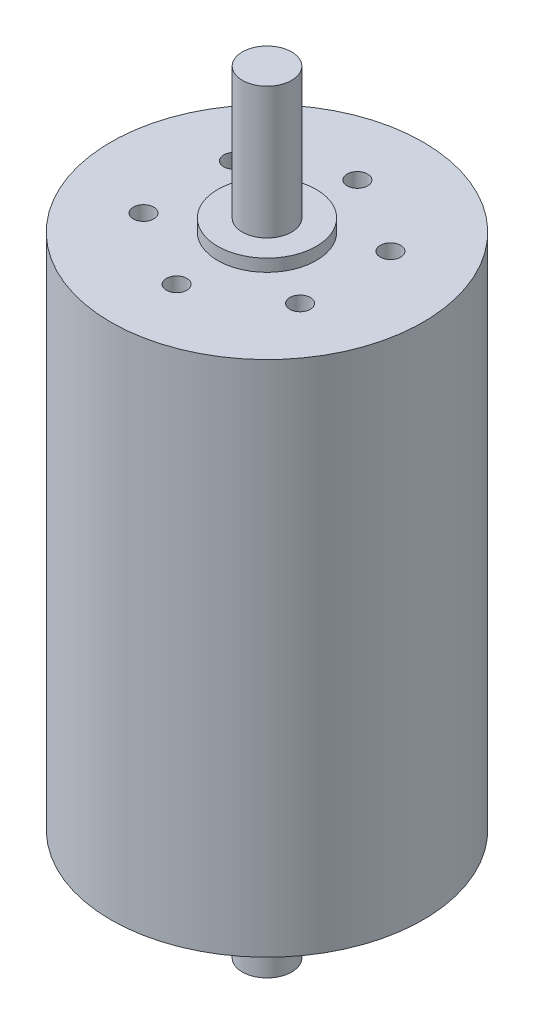
ISO-10303-21;
HEADER;
FILE_DESCRIPTION(('STEP AP214'),'2;1');
FILE_NAME('part.step','',(''),(''),'','','');
FILE_SCHEMA(('AUTOMOTIVE_DESIGN { 1 0 10303 214 1 1 1 1 }'));
ENDSEC;
DATA;
#1=APPLICATION_CONTEXT('core data for automotive mechanical design processes');
#2=APPLICATION_PROTOCOL_DEFINITION('international standard','automotive_design',2000,#1);
#3=PRODUCT_CONTEXT('',#1,'mechanical');
#4=PRODUCT('Part','Part','',(#3));
#5=PRODUCT_RELATED_PRODUCT_CATEGORY('part','',(#4));
#6=PRODUCT_DEFINITION_FORMATION('','',#4);
#7=PRODUCT_DEFINITION_CONTEXT('part definition',#1,'design');
#8=PRODUCT_DEFINITION('design','',#6,#7);
#9=PRODUCT_DEFINITION_SHAPE('','',#8);
#10=(LENGTH_UNIT() NAMED_UNIT(*) SI_UNIT(.MILLI.,.METRE.));
#11=(NAMED_UNIT(*) PLANE_ANGLE_UNIT() SI_UNIT($,.RADIAN.));
#12=(NAMED_UNIT(*) SI_UNIT($,.STERADIAN.) SOLID_ANGLE_UNIT());
#13=UNCERTAINTY_MEASURE_WITH_UNIT(LENGTH_MEASURE(1.E-05),#10,'distance_accuracy_value','');
#14=(GEOMETRIC_REPRESENTATION_CONTEXT(3) GLOBAL_UNCERTAINTY_ASSIGNED_CONTEXT((#13)) GLOBAL_UNIT_ASSIGNED_CONTEXT((#10,
#11,#12)) REPRESENTATION_CONTEXT('',''));
#15=CARTESIAN_POINT('',(0.,0.,0.));
#16=DIRECTION('',(0.,0.,1.));
#17=DIRECTION('',(1.,0.,0.));
#18=AXIS2_PLACEMENT_3D('',#15,#16,#17);
#19=CARTESIAN_POINT('',(3.,0.,0.));
#20=DIRECTION('',(0.,-1.,0.));
#21=DIRECTION('',(0.,0.,-1.));
#22=AXIS2_PLACEMENT_3D('',#19,#20,#21);
#23=PLANE('',#22);
#24=CARTESIAN_POINT('',(0.,0.,0.));
#25=DIRECTION('',(0.,-1.,0.));
#26=DIRECTION('',(0.,0.,-1.));
#27=AXIS2_PLACEMENT_3D('',#24,#25,#26);
#28=CIRCLE('',#27,3.);
#29=CARTESIAN_POINT('',(0.,0.,-3.));
#30=VERTEX_POINT('',#29);
#31=EDGE_CURVE('E67',#30,#30,#28,.T.);
#32=ORIENTED_EDGE('',*,*,#31,.T.);
#33=EDGE_LOOP('',(#32));
#34=FACE_BOUND('',#33,.T.);
#35=ADVANCED_FACE('F33',(#34),#23,.T.);
#36=CARTESIAN_POINT('',(0.,94.,0.));
#37=DIRECTION('',(0.,1.,0.));
#38=DIRECTION('',(0.,0.,1.));
#39=AXIS2_PLACEMENT_3D('',#36,#37,#38);
#40=PLANE('',#39);
#41=CARTESIAN_POINT('',(0.,94.,0.));
#42=DIRECTION('',(0.,-1.,0.));
#43=DIRECTION('',(0.,0.,-1.));
#44=AXIS2_PLACEMENT_3D('',#41,#42,#43);
#45=CIRCLE('',#44,2.99999999999999);
#46=CARTESIAN_POINT('',(0.,94.,-2.99999999999999));
#47=VERTEX_POINT('',#46);
#48=EDGE_CURVE('E10',#47,#47,#45,.T.);
#49=ORIENTED_EDGE('',*,*,#48,.F.);
#50=EDGE_LOOP('',(#49));
#51=FACE_BOUND('',#50,.T.);
#52=ADVANCED_FACE('F191',(#51),#40,.T.);
#53=CARTESIAN_POINT('',(0.,0.,0.));
#54=DIRECTION('',(0.,-1.,0.));
#55=DIRECTION('',(0.,0.,-1.));
#56=AXIS2_PLACEMENT_3D('',#53,#54,#55);
#57=CYLINDRICAL_SURFACE('',#56,2.99999999999999);
#58=ORIENTED_EDGE('',*,*,#48,.T.);
#59=EDGE_LOOP('',(#58));
#60=FACE_BOUND('',#59,.T.);
#61=CARTESIAN_POINT('',(0.,78.,0.));
#62=DIRECTION('',(0.,-1.,0.));
#63=DIRECTION('',(0.,0.,-1.));
#64=AXIS2_PLACEMENT_3D('',#61,#62,#63);
#65=CIRCLE('',#64,2.99999999999999);
#66=CARTESIAN_POINT('',(0.,78.,-2.99999999999999));
#67=VERTEX_POINT('',#66);
#68=EDGE_CURVE('E39',#67,#67,#65,.T.);
#69=ORIENTED_EDGE('',*,*,#68,.F.);
#70=EDGE_LOOP('',(#69));
#71=FACE_BOUND('',#70,.T.);
#72=ADVANCED_FACE('F195',(#60,#71),#57,.T.);
#73=CARTESIAN_POINT('',(2.99999999999999,78.,0.));
#74=DIRECTION('',(0.,1.,0.));
#75=DIRECTION('',(0.,0.,1.));
#76=AXIS2_PLACEMENT_3D('',#73,#74,#75);
#77=PLANE('',#76);
#78=ORIENTED_EDGE('',*,*,#68,.T.);
#79=EDGE_LOOP('',(#78));
#80=FACE_BOUND('',#79,.T.);
#81=CARTESIAN_POINT('',(0.,78.,0.));
#82=DIRECTION('',(0.,-1.,0.));
#83=DIRECTION('',(0.,0.,-1.));
#84=AXIS2_PLACEMENT_3D('',#81,#82,#83);
#85=CIRCLE('',#84,5.99999999999999);
#86=CARTESIAN_POINT('',(0.,78.,-5.99999999999999));
#87=VERTEX_POINT('',#86);
#88=EDGE_CURVE('E43',#87,#87,#85,.T.);
#89=ORIENTED_EDGE('',*,*,#88,.F.);
#90=EDGE_LOOP('',(#89));
#91=FACE_BOUND('',#90,.T.);
#92=ADVANCED_FACE('F200',(#80,#91),#77,.T.);
#93=CARTESIAN_POINT('',(0.,0.,0.));
#94=DIRECTION('',(0.,-1.,0.));
#95=DIRECTION('',(0.,0.,-1.));
#96=AXIS2_PLACEMENT_3D('',#93,#94,#95);
#97=CYLINDRICAL_SURFACE('',#96,5.99999999999999);
#98=ORIENTED_EDGE('',*,*,#88,.T.);
#99=EDGE_LOOP('',(#98));
#100=FACE_BOUND('',#99,.T.);
#101=CARTESIAN_POINT('',(0.,76.5,0.));
#102=DIRECTION('',(0.,-1.,0.));
#103=DIRECTION('',(0.,0.,-1.));
#104=AXIS2_PLACEMENT_3D('',#101,#102,#103);
#105=CIRCLE('',#104,5.99999999999999);
#106=CARTESIAN_POINT('',(0.,76.5,-5.99999999999999));
#107=VERTEX_POINT('',#106);
#108=EDGE_CURVE('E47',#107,#107,#105,.T.);
#109=ORIENTED_EDGE('',*,*,#108,.F.);
#110=EDGE_LOOP('',(#109));
#111=FACE_BOUND('',#110,.T.);
#112=ADVANCED_FACE('F205',(#100,#111),#97,.T.);
#113=CARTESIAN_POINT('',(5.99999999999999,76.5,0.));
#114=DIRECTION('',(0.,1.,0.));
#115=DIRECTION('',(0.,0.,1.));
#116=AXIS2_PLACEMENT_3D('',#113,#114,#115);
#117=PLANE('',#116);
#118=CARTESIAN_POINT('',(9.52627944162882,76.5,-5.5));
#119=DIRECTION('',(0.,1.,0.));
#120=DIRECTION('',(0.,0.,1.));
#121=AXIS2_PLACEMENT_3D('',#118,#119,#120);
#122=CIRCLE('',#121,1.25);
#123=CARTESIAN_POINT('',(9.52627944162882,76.5,-4.25));
#124=VERTEX_POINT('',#123);
#125=EDGE_CURVE('E102',#124,#124,#122,.T.);
#126=ORIENTED_EDGE('',*,*,#125,.F.);
#127=EDGE_LOOP('',(#126));
#128=FACE_BOUND('',#127,.T.);
#129=CARTESIAN_POINT('',(9.52627944162883,76.5,5.5));
#130=DIRECTION('',(0.,1.,0.));
#131=DIRECTION('',(0.,0.,1.));
#132=AXIS2_PLACEMENT_3D('',#129,#130,#131);
#133=CIRCLE('',#132,1.25);
#134=CARTESIAN_POINT('',(9.52627944162883,76.5,6.75));
#135=VERTEX_POINT('',#134);
#136=EDGE_CURVE('E96',#135,#135,#133,.T.);
#137=ORIENTED_EDGE('',*,*,#136,.F.);
#138=EDGE_LOOP('',(#137));
#139=FACE_BOUND('',#138,.T.);
#140=CARTESIAN_POINT('',(0.,76.5,11.));
#141=DIRECTION('',(0.,1.,0.));
#142=DIRECTION('',(0.,0.,1.));
#143=AXIS2_PLACEMENT_3D('',#140,#141,#142);
#144=CIRCLE('',#143,1.25);
#145=CARTESIAN_POINT('',(0.,76.5,12.25));
#146=VERTEX_POINT('',#145);
#147=EDGE_CURVE('E90',#146,#146,#144,.T.);
#148=ORIENTED_EDGE('',*,*,#147,.F.);
#149=EDGE_LOOP('',(#148));
#150=FACE_BOUND('',#149,.T.);
#151=CARTESIAN_POINT('',(-9.52627944162882,76.5,5.50000000000001));
#152=DIRECTION('',(0.,1.,0.));
#153=DIRECTION('',(0.,0.,1.));
#154=AXIS2_PLACEMENT_3D('',#151,#152,#153);
#155=CIRCLE('',#154,1.25);
#156=CARTESIAN_POINT('',(-9.52627944162882,76.5,6.75));
#157=VERTEX_POINT('',#156);
#158=EDGE_CURVE('E84',#157,#157,#155,.T.);
#159=ORIENTED_EDGE('',*,*,#158,.F.);
#160=EDGE_LOOP('',(#159));
#161=FACE_BOUND('',#160,.T.);
#162=CARTESIAN_POINT('',(-9.52627944162883,76.5,-5.49999999999999));
#163=DIRECTION('',(0.,1.,0.));
#164=DIRECTION('',(0.,0.,1.));
#165=AXIS2_PLACEMENT_3D('',#162,#163,#164);
#166=CIRCLE('',#165,1.25);
#167=CARTESIAN_POINT('',(-9.52627944162883,76.5,-4.24999999999999));
#168=VERTEX_POINT('',#167);
#169=EDGE_CURVE('E77',#168,#168,#166,.T.);
#170=ORIENTED_EDGE('',*,*,#169,.F.);
#171=EDGE_LOOP('',(#170));
#172=FACE_BOUND('',#171,.T.);
#173=CARTESIAN_POINT('',(0.,76.5,-11.));
#174=DIRECTION('',(0.,1.,0.));
#175=DIRECTION('',(0.,0.,1.));
#176=AXIS2_PLACEMENT_3D('',#173,#174,#175);
#177=CIRCLE('',#176,1.25);
#178=CARTESIAN_POINT('',(0.,76.5,-9.75));
#179=VERTEX_POINT('',#178);
#180=EDGE_CURVE('E71',#179,#179,#177,.T.);
#181=ORIENTED_EDGE('',*,*,#180,.F.);
#182=EDGE_LOOP('',(#181));
#183=FACE_BOUND('',#182,.T.);
#184=ORIENTED_EDGE('',*,*,#108,.T.);
#185=EDGE_LOOP('',(#184));
#186=FACE_BOUND('',#185,.T.);
#187=CARTESIAN_POINT('',(0.,76.5,0.));
#188=DIRECTION('',(0.,-1.,0.));
#189=DIRECTION('',(0.,0.,-1.));
#190=AXIS2_PLACEMENT_3D('',#187,#188,#189);
#191=CIRCLE('',#190,19.);
#192=CARTESIAN_POINT('',(0.,76.5,-19.));
#193=VERTEX_POINT('',#192);
#194=EDGE_CURVE('E52',#193,#193,#191,.T.);
#195=ORIENTED_EDGE('',*,*,#194,.F.);
#196=EDGE_LOOP('',(#195));
#197=FACE_BOUND('',#196,.T.);
#198=ADVANCED_FACE('F208',(#128,#139,#150,#161,#172,#183,#186,#197),#117,.T.);
#199=CARTESIAN_POINT('',(0.,0.,0.));
#200=DIRECTION('',(0.,-1.,0.));
#201=DIRECTION('',(0.,0.,-1.));
#202=AXIS2_PLACEMENT_3D('',#199,#200,#201);
#203=CYLINDRICAL_SURFACE('',#202,19.);
#204=ORIENTED_EDGE('',*,*,#194,.T.);
#205=EDGE_LOOP('',(#204));
#206=FACE_BOUND('',#205,.T.);
#207=CARTESIAN_POINT('',(0.,13.5,0.));
#208=DIRECTION('',(0.,-1.,0.));
#209=DIRECTION('',(0.,0.,-1.));
#210=AXIS2_PLACEMENT_3D('',#207,#208,#209);
#211=CIRCLE('',#210,19.);
#212=CARTESIAN_POINT('',(0.,13.5,-19.));
#213=VERTEX_POINT('',#212);
#214=EDGE_CURVE('E55',#213,#213,#211,.T.);
#215=ORIENTED_EDGE('',*,*,#214,.F.);
#216=EDGE_LOOP('',(#215));
#217=FACE_BOUND('',#216,.T.);
#218=ADVANCED_FACE('F156',(#206,#217),#203,.T.);
#219=CARTESIAN_POINT('',(19.,13.5,0.));
#220=DIRECTION('',(0.,-1.,0.));
#221=DIRECTION('',(0.,0.,-1.));
#222=AXIS2_PLACEMENT_3D('',#219,#220,#221);
#223=PLANE('',#222);
#224=CARTESIAN_POINT('',(9.52627944162882,13.5,-5.5));
#225=DIRECTION('',(0.,-1.,0.));
#226=DIRECTION('',(0.,0.,-1.));
#227=AXIS2_PLACEMENT_3D('',#224,#225,#226);
#228=CIRCLE('',#227,1.25);
#229=CARTESIAN_POINT('',(9.52627944162882,13.5,-6.75));
#230=VERTEX_POINT('',#229);
#231=EDGE_CURVE('E137',#230,#230,#228,.T.);
#232=ORIENTED_EDGE('',*,*,#231,.F.);
#233=EDGE_LOOP('',(#232));
#234=FACE_BOUND('',#233,.T.);
#235=CARTESIAN_POINT('',(9.52627944162883,13.5,5.5));
#236=DIRECTION('',(0.,-1.,0.));
#237=DIRECTION('',(0.,0.,-1.));
#238=AXIS2_PLACEMENT_3D('',#235,#236,#237);
#239=CIRCLE('',#238,1.25);
#240=CARTESIAN_POINT('',(9.52627944162883,13.5,4.25));
#241=VERTEX_POINT('',#240);
#242=EDGE_CURVE('E131',#241,#241,#239,.T.);
#243=ORIENTED_EDGE('',*,*,#242,.F.);
#244=EDGE_LOOP('',(#243));
#245=FACE_BOUND('',#244,.T.);
#246=CARTESIAN_POINT('',(0.,13.5,11.));
#247=DIRECTION('',(0.,-1.,0.));
#248=DIRECTION('',(0.,0.,-1.));
#249=AXIS2_PLACEMENT_3D('',#246,#247,#248);
#250=CIRCLE('',#249,1.25);
#251=CARTESIAN_POINT('',(0.,13.5,9.75));
#252=VERTEX_POINT('',#251);
#253=EDGE_CURVE('E125',#252,#252,#250,.T.);
#254=ORIENTED_EDGE('',*,*,#253,.F.);
#255=EDGE_LOOP('',(#254));
#256=FACE_BOUND('',#255,.T.);
#257=CARTESIAN_POINT('',(-9.52627944162882,13.5,5.50000000000001));
#258=DIRECTION('',(0.,-1.,0.));
#259=DIRECTION('',(0.,0.,-1.));
#260=AXIS2_PLACEMENT_3D('',#257,#258,#259);
#261=CIRCLE('',#260,1.25);
#262=CARTESIAN_POINT('',(-9.52627944162882,13.5,4.25000000000001));
#263=VERTEX_POINT('',#262);
#264=EDGE_CURVE('E119',#263,#263,#261,.T.);
#265=ORIENTED_EDGE('',*,*,#264,.F.);
#266=EDGE_LOOP('',(#265));
#267=FACE_BOUND('',#266,.T.);
#268=CARTESIAN_POINT('',(-9.52627944162883,13.5,-5.49999999999999));
#269=DIRECTION('',(0.,-1.,0.));
#270=DIRECTION('',(0.,0.,-1.));
#271=AXIS2_PLACEMENT_3D('',#268,#269,#270);
#272=CIRCLE('',#271,1.25);
#273=CARTESIAN_POINT('',(-9.52627944162883,13.5,-6.74999999999999));
#274=VERTEX_POINT('',#273);
#275=EDGE_CURVE('E113',#274,#274,#272,.T.);
#276=ORIENTED_EDGE('',*,*,#275,.F.);
#277=EDGE_LOOP('',(#276));
#278=FACE_BOUND('',#277,.T.);
#279=CARTESIAN_POINT('',(0.,13.5,-11.));
#280=DIRECTION('',(0.,-1.,0.));
#281=DIRECTION('',(0.,0.,-1.));
#282=AXIS2_PLACEMENT_3D('',#279,#280,#281);
#283=CIRCLE('',#282,1.25);
#284=CARTESIAN_POINT('',(0.,13.5,-12.25));
#285=VERTEX_POINT('',#284);
#286=EDGE_CURVE('E107',#285,#285,#283,.T.);
#287=ORIENTED_EDGE('',*,*,#286,.F.);
#288=EDGE_LOOP('',(#287));
#289=FACE_BOUND('',#288,.T.);
#290=ORIENTED_EDGE('',*,*,#214,.T.);
#291=EDGE_LOOP('',(#290));
#292=FACE_BOUND('',#291,.T.);
#293=CARTESIAN_POINT('',(0.,13.5,0.));
#294=DIRECTION('',(0.,-1.,0.));
#295=DIRECTION('',(0.,0.,-1.));
#296=AXIS2_PLACEMENT_3D('',#293,#294,#295);
#297=CIRCLE('',#296,6.);
#298=CARTESIAN_POINT('',(0.,13.5,-6.));
#299=VERTEX_POINT('',#298);
#300=EDGE_CURVE('E58',#299,#299,#297,.T.);
#301=ORIENTED_EDGE('',*,*,#300,.F.);
#302=EDGE_LOOP('',(#301));
#303=FACE_BOUND('',#302,.T.);
#304=ADVANCED_FACE('F152',(#234,#245,#256,#267,#278,#289,#292,#303),#223,.T.);
#305=CARTESIAN_POINT('',(0.,0.,0.));
#306=DIRECTION('',(0.,-1.,0.));
#307=DIRECTION('',(0.,0.,-1.));
#308=AXIS2_PLACEMENT_3D('',#305,#306,#307);
#309=CYLINDRICAL_SURFACE('',#308,6.);
#310=ORIENTED_EDGE('',*,*,#300,.T.);
#311=EDGE_LOOP('',(#310));
#312=FACE_BOUND('',#311,.T.);
#313=CARTESIAN_POINT('',(0.,12.,0.));
#314=DIRECTION('',(0.,-1.,0.));
#315=DIRECTION('',(0.,0.,-1.));
#316=AXIS2_PLACEMENT_3D('',#313,#314,#315);
#317=CIRCLE('',#316,6.);
#318=CARTESIAN_POINT('',(0.,12.,-6.));
#319=VERTEX_POINT('',#318);
#320=EDGE_CURVE('E61',#319,#319,#317,.T.);
#321=ORIENTED_EDGE('',*,*,#320,.F.);
#322=EDGE_LOOP('',(#321));
#323=FACE_BOUND('',#322,.T.);
#324=ADVANCED_FACE('F155',(#312,#323),#309,.T.);
#325=CARTESIAN_POINT('',(6.,12.,0.));
#326=DIRECTION('',(0.,-1.,0.));
#327=DIRECTION('',(0.,0.,-1.));
#328=AXIS2_PLACEMENT_3D('',#325,#326,#327);
#329=PLANE('',#328);
#330=ORIENTED_EDGE('',*,*,#320,.T.);
#331=EDGE_LOOP('',(#330));
#332=FACE_BOUND('',#331,.T.);
#333=CARTESIAN_POINT('',(0.,12.,0.));
#334=DIRECTION('',(0.,-1.,0.));
#335=DIRECTION('',(0.,0.,-1.));
#336=AXIS2_PLACEMENT_3D('',#333,#334,#335);
#337=CIRCLE('',#336,3.);
#338=CARTESIAN_POINT('',(0.,12.,-3.));
#339=VERTEX_POINT('',#338);
#340=EDGE_CURVE('E64',#339,#339,#337,.T.);
#341=ORIENTED_EDGE('',*,*,#340,.F.);
#342=EDGE_LOOP('',(#341));
#343=FACE_BOUND('',#342,.T.);
#344=ADVANCED_FACE('F174',(#332,#343),#329,.T.);
#345=CARTESIAN_POINT('',(0.,0.,0.));
#346=DIRECTION('',(0.,-1.,0.));
#347=DIRECTION('',(0.,0.,-1.));
#348=AXIS2_PLACEMENT_3D('',#345,#346,#347);
#349=CYLINDRICAL_SURFACE('',#348,3.);
#350=ORIENTED_EDGE('',*,*,#340,.T.);
#351=EDGE_LOOP('',(#350));
#352=FACE_BOUND('',#351,.T.);
#353=ORIENTED_EDGE('',*,*,#31,.F.);
#354=EDGE_LOOP('',(#353));
#355=FACE_BOUND('',#354,.T.);
#356=ADVANCED_FACE('F180',(#352,#355),#349,.T.);
#357=CARTESIAN_POINT('',(0.,71.5,-11.));
#358=DIRECTION('',(0.,1.,0.));
#359=DIRECTION('',(0.,0.,1.));
#360=AXIS2_PLACEMENT_3D('',#357,#358,#359);
#361=CYLINDRICAL_SURFACE('',#360,1.25);
#362=CARTESIAN_POINT('',(0.,71.5,-11.));
#363=DIRECTION('',(0.,1.,0.));
#364=DIRECTION('',(0.,0.,1.));
#365=AXIS2_PLACEMENT_3D('',#362,#363,#364);
#366=CIRCLE('',#365,1.25);
#367=CARTESIAN_POINT('',(0.,71.5,-9.75));
#368=VERTEX_POINT('',#367);
#369=EDGE_CURVE('E70',#368,#368,#366,.T.);
#370=ORIENTED_EDGE('',*,*,#369,.F.);
#371=EDGE_LOOP('',(#370));
#372=FACE_BOUND('',#371,.T.);
#373=ORIENTED_EDGE('',*,*,#180,.T.);
#374=EDGE_LOOP('',(#373));
#375=FACE_BOUND('',#374,.T.);
#376=ADVANCED_FACE('F186',(#372,#375),#361,.F.);
#377=CARTESIAN_POINT('',(0.,71.5,-11.));
#378=DIRECTION('',(0.,1.,0.));
#379=DIRECTION('',(0.,0.,1.));
#380=AXIS2_PLACEMENT_3D('',#377,#378,#379);
#381=PLANE('',#380);
#382=ORIENTED_EDGE('',*,*,#369,.T.);
#383=EDGE_LOOP('',(#382));
#384=FACE_BOUND('',#383,.T.);
#385=ADVANCED_FACE('F218',(#384),#381,.T.);
#386=CARTESIAN_POINT('',(-9.52627944162883,71.5,-5.49999999999999));
#387=DIRECTION('',(0.,1.,0.));
#388=DIRECTION('',(0.,0.,1.));
#389=AXIS2_PLACEMENT_3D('',#386,#387,#388);
#390=CYLINDRICAL_SURFACE('',#389,1.25);
#391=CARTESIAN_POINT('',(-9.52627944162883,71.5,-5.49999999999999));
#392=DIRECTION('',(0.,1.,0.));
#393=DIRECTION('',(0.,0.,1.));
#394=AXIS2_PLACEMENT_3D('',#391,#392,#393);
#395=CIRCLE('',#394,1.25);
#396=CARTESIAN_POINT('',(-9.52627944162883,71.5,-4.24999999999999));
#397=VERTEX_POINT('',#396);
#398=EDGE_CURVE('E80',#397,#397,#395,.T.);
#399=ORIENTED_EDGE('',*,*,#398,.F.);
#400=EDGE_LOOP('',(#399));
#401=FACE_BOUND('',#400,.T.);
#402=ORIENTED_EDGE('',*,*,#169,.T.);
#403=EDGE_LOOP('',(#402));
#404=FACE_BOUND('',#403,.T.);
#405=ADVANCED_FACE('F222',(#401,#404),#390,.F.);
#406=CARTESIAN_POINT('',(-9.52627944162883,71.5,-5.49999999999999));
#407=DIRECTION('',(0.,1.,0.));
#408=DIRECTION('',(0.,0.,1.));
#409=AXIS2_PLACEMENT_3D('',#406,#407,#408);
#410=PLANE('',#409);
#411=ORIENTED_EDGE('',*,*,#398,.T.);
#412=EDGE_LOOP('',(#411));
#413=FACE_BOUND('',#412,.T.);
#414=ADVANCED_FACE('F226',(#413),#410,.T.);
#415=CARTESIAN_POINT('',(-9.52627944162882,71.5,5.50000000000001));
#416=DIRECTION('',(0.,1.,0.));
#417=DIRECTION('',(0.,0.,1.));
#418=AXIS2_PLACEMENT_3D('',#415,#416,#417);
#419=CYLINDRICAL_SURFACE('',#418,1.25);
#420=CARTESIAN_POINT('',(-9.52627944162882,71.5,5.50000000000001));
#421=DIRECTION('',(0.,1.,0.));
#422=DIRECTION('',(0.,0.,1.));
#423=AXIS2_PLACEMENT_3D('',#420,#421,#422);
#424=CIRCLE('',#423,1.25);
#425=CARTESIAN_POINT('',(-9.52627944162882,71.5,6.75));
#426=VERTEX_POINT('',#425);
#427=EDGE_CURVE('E87',#426,#426,#424,.T.);
#428=ORIENTED_EDGE('',*,*,#427,.F.);
#429=EDGE_LOOP('',(#428));
#430=FACE_BOUND('',#429,.T.);
#431=ORIENTED_EDGE('',*,*,#158,.T.);
#432=EDGE_LOOP('',(#431));
#433=FACE_BOUND('',#432,.T.);
#434=ADVANCED_FACE('F230',(#430,#433),#419,.F.);
#435=CARTESIAN_POINT('',(-9.52627944162882,71.5,5.50000000000001));
#436=DIRECTION('',(0.,1.,0.));
#437=DIRECTION('',(0.,0.,1.));
#438=AXIS2_PLACEMENT_3D('',#435,#436,#437);
#439=PLANE('',#438);
#440=ORIENTED_EDGE('',*,*,#427,.T.);
#441=EDGE_LOOP('',(#440));
#442=FACE_BOUND('',#441,.T.);
#443=ADVANCED_FACE('F234',(#442),#439,.T.);
#444=CARTESIAN_POINT('',(0.,71.5,11.));
#445=DIRECTION('',(0.,1.,0.));
#446=DIRECTION('',(0.,0.,1.));
#447=AXIS2_PLACEMENT_3D('',#444,#445,#446);
#448=CYLINDRICAL_SURFACE('',#447,1.25);
#449=CARTESIAN_POINT('',(0.,71.5,11.));
#450=DIRECTION('',(0.,1.,0.));
#451=DIRECTION('',(0.,0.,1.));
#452=AXIS2_PLACEMENT_3D('',#449,#450,#451);
#453=CIRCLE('',#452,1.25);
#454=CARTESIAN_POINT('',(0.,71.5,12.25));
#455=VERTEX_POINT('',#454);
#456=EDGE_CURVE('E93',#455,#455,#453,.T.);
#457=ORIENTED_EDGE('',*,*,#456,.F.);
#458=EDGE_LOOP('',(#457));
#459=FACE_BOUND('',#458,.T.);
#460=ORIENTED_EDGE('',*,*,#147,.T.);
#461=EDGE_LOOP('',(#460));
#462=FACE_BOUND('',#461,.T.);
#463=ADVANCED_FACE('F238',(#459,#462),#448,.F.);
#464=CARTESIAN_POINT('',(0.,71.5,11.));
#465=DIRECTION('',(0.,1.,0.));
#466=DIRECTION('',(0.,0.,1.));
#467=AXIS2_PLACEMENT_3D('',#464,#465,#466);
#468=PLANE('',#467);
#469=ORIENTED_EDGE('',*,*,#456,.T.);
#470=EDGE_LOOP('',(#469));
#471=FACE_BOUND('',#470,.T.);
#472=ADVANCED_FACE('F242',(#471),#468,.T.);
#473=CARTESIAN_POINT('',(9.52627944162883,71.5,5.5));
#474=DIRECTION('',(0.,1.,0.));
#475=DIRECTION('',(0.,0.,1.));
#476=AXIS2_PLACEMENT_3D('',#473,#474,#475);
#477=CYLINDRICAL_SURFACE('',#476,1.25);
#478=CARTESIAN_POINT('',(9.52627944162883,71.5,5.5));
#479=DIRECTION('',(0.,1.,0.));
#480=DIRECTION('',(0.,0.,1.));
#481=AXIS2_PLACEMENT_3D('',#478,#479,#480);
#482=CIRCLE('',#481,1.25);
#483=CARTESIAN_POINT('',(9.52627944162883,71.5,6.75));
#484=VERTEX_POINT('',#483);
#485=EDGE_CURVE('E99',#484,#484,#482,.T.);
#486=ORIENTED_EDGE('',*,*,#485,.F.);
#487=EDGE_LOOP('',(#486));
#488=FACE_BOUND('',#487,.T.);
#489=ORIENTED_EDGE('',*,*,#136,.T.);
#490=EDGE_LOOP('',(#489));
#491=FACE_BOUND('',#490,.T.);
#492=ADVANCED_FACE('F246',(#488,#491),#477,.F.);
#493=CARTESIAN_POINT('',(9.52627944162883,71.5,5.5));
#494=DIRECTION('',(0.,1.,0.));
#495=DIRECTION('',(0.,0.,1.));
#496=AXIS2_PLACEMENT_3D('',#493,#494,#495);
#497=PLANE('',#496);
#498=ORIENTED_EDGE('',*,*,#485,.T.);
#499=EDGE_LOOP('',(#498));
#500=FACE_BOUND('',#499,.T.);
#501=ADVANCED_FACE('F250',(#500),#497,.T.);
#502=CARTESIAN_POINT('',(9.52627944162882,71.5,-5.5));
#503=DIRECTION('',(0.,1.,0.));
#504=DIRECTION('',(0.,0.,1.));
#505=AXIS2_PLACEMENT_3D('',#502,#503,#504);
#506=CYLINDRICAL_SURFACE('',#505,1.25);
#507=CARTESIAN_POINT('',(9.52627944162882,71.5,-5.5));
#508=DIRECTION('',(0.,1.,0.));
#509=DIRECTION('',(0.,0.,1.));
#510=AXIS2_PLACEMENT_3D('',#507,#508,#509);
#511=CIRCLE('',#510,1.25);
#512=CARTESIAN_POINT('',(9.52627944162882,71.5,-4.25));
#513=VERTEX_POINT('',#512);
#514=EDGE_CURVE('E74',#513,#513,#511,.T.);
#515=ORIENTED_EDGE('',*,*,#514,.F.);
#516=EDGE_LOOP('',(#515));
#517=FACE_BOUND('',#516,.T.);
#518=ORIENTED_EDGE('',*,*,#125,.T.);
#519=EDGE_LOOP('',(#518));
#520=FACE_BOUND('',#519,.T.);
#521=ADVANCED_FACE('F254',(#517,#520),#506,.F.);
#522=CARTESIAN_POINT('',(9.52627944162882,71.5,-5.5));
#523=DIRECTION('',(0.,1.,0.));
#524=DIRECTION('',(0.,0.,1.));
#525=AXIS2_PLACEMENT_3D('',#522,#523,#524);
#526=PLANE('',#525);
#527=ORIENTED_EDGE('',*,*,#514,.T.);
#528=EDGE_LOOP('',(#527));
#529=FACE_BOUND('',#528,.T.);
#530=ADVANCED_FACE('F258',(#529),#526,.T.);
#531=CARTESIAN_POINT('',(0.,18.5,-11.));
#532=DIRECTION('',(0.,-1.,0.));
#533=DIRECTION('',(0.,0.,-1.));
#534=AXIS2_PLACEMENT_3D('',#531,#532,#533);
#535=CYLINDRICAL_SURFACE('',#534,1.25);
#536=CARTESIAN_POINT('',(0.,18.5,-11.));
#537=DIRECTION('',(0.,-1.,0.));
#538=DIRECTION('',(0.,0.,-1.));
#539=AXIS2_PLACEMENT_3D('',#536,#537,#538);
#540=CIRCLE('',#539,1.25);
#541=CARTESIAN_POINT('',(0.,18.5,-12.25));
#542=VERTEX_POINT('',#541);
#543=EDGE_CURVE('E81',#542,#542,#540,.T.);
#544=ORIENTED_EDGE('',*,*,#543,.F.);
#545=EDGE_LOOP('',(#544));
#546=FACE_BOUND('',#545,.T.);
#547=ORIENTED_EDGE('',*,*,#286,.T.);
#548=EDGE_LOOP('',(#547));
#549=FACE_BOUND('',#548,.T.);
#550=ADVANCED_FACE('F262',(#546,#549),#535,.F.);
#551=CARTESIAN_POINT('',(0.,18.5,-11.));
#552=DIRECTION('',(0.,-1.,0.));
#553=DIRECTION('',(0.,0.,-1.));
#554=AXIS2_PLACEMENT_3D('',#551,#552,#553);
#555=PLANE('',#554);
#556=ORIENTED_EDGE('',*,*,#543,.T.);
#557=EDGE_LOOP('',(#556));
#558=FACE_BOUND('',#557,.T.);
#559=ADVANCED_FACE('F266',(#558),#555,.T.);
#560=CARTESIAN_POINT('',(-9.52627944162883,18.5,-5.49999999999999));
#561=DIRECTION('',(0.,-1.,0.));
#562=DIRECTION('',(0.,0.,-1.));
#563=AXIS2_PLACEMENT_3D('',#560,#561,#562);
#564=CYLINDRICAL_SURFACE('',#563,1.25);
#565=CARTESIAN_POINT('',(-9.52627944162883,18.5,-5.49999999999999));
#566=DIRECTION('',(0.,-1.,0.));
#567=DIRECTION('',(0.,0.,-1.));
#568=AXIS2_PLACEMENT_3D('',#565,#566,#567);
#569=CIRCLE('',#568,1.25);
#570=CARTESIAN_POINT('',(-9.52627944162883,18.5,-6.74999999999999));
#571=VERTEX_POINT('',#570);
#572=EDGE_CURVE('E116',#571,#571,#569,.T.);
#573=ORIENTED_EDGE('',*,*,#572,.F.);
#574=EDGE_LOOP('',(#573));
#575=FACE_BOUND('',#574,.T.);
#576=ORIENTED_EDGE('',*,*,#275,.T.);
#577=EDGE_LOOP('',(#576));
#578=FACE_BOUND('',#577,.T.);
#579=ADVANCED_FACE('F270',(#575,#578),#564,.F.);
#580=CARTESIAN_POINT('',(-9.52627944162883,18.5,-5.49999999999999));
#581=DIRECTION('',(0.,-1.,0.));
#582=DIRECTION('',(0.,0.,-1.));
#583=AXIS2_PLACEMENT_3D('',#580,#581,#582);
#584=PLANE('',#583);
#585=ORIENTED_EDGE('',*,*,#572,.T.);
#586=EDGE_LOOP('',(#585));
#587=FACE_BOUND('',#586,.T.);
#588=ADVANCED_FACE('F274',(#587),#584,.T.);
#589=CARTESIAN_POINT('',(-9.52627944162882,18.5,5.50000000000001));
#590=DIRECTION('',(0.,-1.,0.));
#591=DIRECTION('',(0.,0.,-1.));
#592=AXIS2_PLACEMENT_3D('',#589,#590,#591);
#593=CYLINDRICAL_SURFACE('',#592,1.25);
#594=CARTESIAN_POINT('',(-9.52627944162882,18.5,5.50000000000001));
#595=DIRECTION('',(0.,-1.,0.));
#596=DIRECTION('',(0.,0.,-1.));
#597=AXIS2_PLACEMENT_3D('',#594,#595,#596);
#598=CIRCLE('',#597,1.25);
#599=CARTESIAN_POINT('',(-9.52627944162882,18.5,4.25000000000001));
#600=VERTEX_POINT('',#599);
#601=EDGE_CURVE('E122',#600,#600,#598,.T.);
#602=ORIENTED_EDGE('',*,*,#601,.F.);
#603=EDGE_LOOP('',(#602));
#604=FACE_BOUND('',#603,.T.);
#605=ORIENTED_EDGE('',*,*,#264,.T.);
#606=EDGE_LOOP('',(#605));
#607=FACE_BOUND('',#606,.T.);
#608=ADVANCED_FACE('F278',(#604,#607),#593,.F.);
#609=CARTESIAN_POINT('',(-9.52627944162882,18.5,5.50000000000001));
#610=DIRECTION('',(0.,-1.,0.));
#611=DIRECTION('',(0.,0.,-1.));
#612=AXIS2_PLACEMENT_3D('',#609,#610,#611);
#613=PLANE('',#612);
#614=ORIENTED_EDGE('',*,*,#601,.T.);
#615=EDGE_LOOP('',(#614));
#616=FACE_BOUND('',#615,.T.);
#617=ADVANCED_FACE('F282',(#616),#613,.T.);
#618=CARTESIAN_POINT('',(0.,18.5,11.));
#619=DIRECTION('',(0.,-1.,0.));
#620=DIRECTION('',(0.,0.,-1.));
#621=AXIS2_PLACEMENT_3D('',#618,#619,#620);
#622=CYLINDRICAL_SURFACE('',#621,1.25);
#623=CARTESIAN_POINT('',(0.,18.5,11.));
#624=DIRECTION('',(0.,-1.,0.));
#625=DIRECTION('',(0.,0.,-1.));
#626=AXIS2_PLACEMENT_3D('',#623,#624,#625);
#627=CIRCLE('',#626,1.25);
#628=CARTESIAN_POINT('',(0.,18.5,9.75));
#629=VERTEX_POINT('',#628);
#630=EDGE_CURVE('E128',#629,#629,#627,.T.);
#631=ORIENTED_EDGE('',*,*,#630,.F.);
#632=EDGE_LOOP('',(#631));
#633=FACE_BOUND('',#632,.T.);
#634=ORIENTED_EDGE('',*,*,#253,.T.);
#635=EDGE_LOOP('',(#634));
#636=FACE_BOUND('',#635,.T.);
#637=ADVANCED_FACE('F286',(#633,#636),#622,.F.);
#638=CARTESIAN_POINT('',(0.,18.5,11.));
#639=DIRECTION('',(0.,-1.,0.));
#640=DIRECTION('',(0.,0.,-1.));
#641=AXIS2_PLACEMENT_3D('',#638,#639,#640);
#642=PLANE('',#641);
#643=ORIENTED_EDGE('',*,*,#630,.T.);
#644=EDGE_LOOP('',(#643));
#645=FACE_BOUND('',#644,.T.);
#646=ADVANCED_FACE('F290',(#645),#642,.T.);
#647=CARTESIAN_POINT('',(9.52627944162883,18.5,5.5));
#648=DIRECTION('',(0.,-1.,0.));
#649=DIRECTION('',(0.,0.,-1.));
#650=AXIS2_PLACEMENT_3D('',#647,#648,#649);
#651=CYLINDRICAL_SURFACE('',#650,1.25);
#652=CARTESIAN_POINT('',(9.52627944162883,18.5,5.5));
#653=DIRECTION('',(0.,-1.,0.));
#654=DIRECTION('',(0.,0.,-1.));
#655=AXIS2_PLACEMENT_3D('',#652,#653,#654);
#656=CIRCLE('',#655,1.25);
#657=CARTESIAN_POINT('',(9.52627944162883,18.5,4.25));
#658=VERTEX_POINT('',#657);
#659=EDGE_CURVE('E134',#658,#658,#656,.T.);
#660=ORIENTED_EDGE('',*,*,#659,.F.);
#661=EDGE_LOOP('',(#660));
#662=FACE_BOUND('',#661,.T.);
#663=ORIENTED_EDGE('',*,*,#242,.T.);
#664=EDGE_LOOP('',(#663));
#665=FACE_BOUND('',#664,.T.);
#666=ADVANCED_FACE('F294',(#662,#665),#651,.F.);
#667=CARTESIAN_POINT('',(9.52627944162883,18.5,5.5));
#668=DIRECTION('',(0.,-1.,0.));
#669=DIRECTION('',(0.,0.,-1.));
#670=AXIS2_PLACEMENT_3D('',#667,#668,#669);
#671=PLANE('',#670);
#672=ORIENTED_EDGE('',*,*,#659,.T.);
#673=EDGE_LOOP('',(#672));
#674=FACE_BOUND('',#673,.T.);
#675=ADVANCED_FACE('F148',(#674),#671,.T.);
#676=CARTESIAN_POINT('',(9.52627944162882,18.5,-5.5));
#677=DIRECTION('',(0.,-1.,0.));
#678=DIRECTION('',(0.,0.,-1.));
#679=AXIS2_PLACEMENT_3D('',#676,#677,#678);
#680=CYLINDRICAL_SURFACE('',#679,1.25);
#681=CARTESIAN_POINT('',(9.52627944162882,18.5,-5.5));
#682=DIRECTION('',(0.,-1.,0.));
#683=DIRECTION('',(0.,0.,-1.));
#684=AXIS2_PLACEMENT_3D('',#681,#682,#683);
#685=CIRCLE('',#684,1.25);
#686=CARTESIAN_POINT('',(9.52627944162882,18.5,-6.75));
#687=VERTEX_POINT('',#686);
#688=EDGE_CURVE('E110',#687,#687,#685,.T.);
#689=ORIENTED_EDGE('',*,*,#688,.F.);
#690=EDGE_LOOP('',(#689));
#691=FACE_BOUND('',#690,.T.);
#692=ORIENTED_EDGE('',*,*,#231,.T.);
#693=EDGE_LOOP('',(#692));
#694=FACE_BOUND('',#693,.T.);
#695=ADVANCED_FACE('F145',(#691,#694),#680,.F.);
#696=CARTESIAN_POINT('',(9.52627944162882,18.5,-5.5));
#697=DIRECTION('',(0.,-1.,0.));
#698=DIRECTION('',(0.,0.,-1.));
#699=AXIS2_PLACEMENT_3D('',#696,#697,#698);
#700=PLANE('',#699);
#701=ORIENTED_EDGE('',*,*,#688,.T.);
#702=EDGE_LOOP('',(#701));
#703=FACE_BOUND('',#702,.T.);
#704=ADVANCED_FACE('F143',(#703),#700,.T.);
#705=CLOSED_SHELL('',(#35,#52,#72,#92,#112,#198,#218,#304,#324,#344,#356,#376,#385,#405,#414,
#434,#443,#463,#472,#492,#501,#521,#530,#550,#559,#579,#588,#608,#617,#637,#646,#666,#675,#695,#704));
#706=MANIFOLD_SOLID_BREP('B2',#705);
#707=ADVANCED_BREP_SHAPE_REPRESENTATION('',(#18,#706),#14);
#708=SHAPE_DEFINITION_REPRESENTATION(#9,#707);
ENDSEC;
END-ISO-10303-21;
